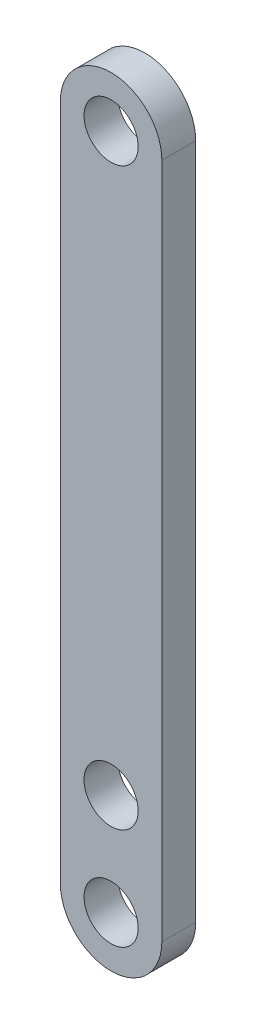
ISO-10303-21;
HEADER;
FILE_DESCRIPTION(('STEP AP214'),'2;1');
FILE_NAME('part.step','',(''),(''),'','','');
FILE_SCHEMA(('AUTOMOTIVE_DESIGN { 1 0 10303 214 1 1 1 1 }'));
ENDSEC;
DATA;
#1=APPLICATION_CONTEXT('core data for automotive mechanical design processes');
#2=APPLICATION_PROTOCOL_DEFINITION('international standard','automotive_design',2000,#1);
#3=PRODUCT_CONTEXT('',#1,'mechanical');
#4=PRODUCT('Part','Part','',(#3));
#5=PRODUCT_RELATED_PRODUCT_CATEGORY('part','',(#4));
#6=PRODUCT_DEFINITION_FORMATION('','',#4);
#7=PRODUCT_DEFINITION_CONTEXT('part definition',#1,'design');
#8=PRODUCT_DEFINITION('design','',#6,#7);
#9=PRODUCT_DEFINITION_SHAPE('','',#8);
#10=(LENGTH_UNIT() NAMED_UNIT(*) SI_UNIT(.MILLI.,.METRE.));
#11=(NAMED_UNIT(*) PLANE_ANGLE_UNIT() SI_UNIT($,.RADIAN.));
#12=(NAMED_UNIT(*) SI_UNIT($,.STERADIAN.) SOLID_ANGLE_UNIT());
#13=UNCERTAINTY_MEASURE_WITH_UNIT(LENGTH_MEASURE(1.E-05),#10,'distance_accuracy_value','');
#14=(GEOMETRIC_REPRESENTATION_CONTEXT(3) GLOBAL_UNCERTAINTY_ASSIGNED_CONTEXT((#13)) GLOBAL_UNIT_ASSIGNED_CONTEXT((#10,
#11,#12)) REPRESENTATION_CONTEXT('',''));
#15=CARTESIAN_POINT('',(0.,0.,0.));
#16=DIRECTION('',(0.,0.,1.));
#17=DIRECTION('',(1.,0.,0.));
#18=AXIS2_PLACEMENT_3D('',#15,#16,#17);
#19=CARTESIAN_POINT('',(0.,50.,5.));
#20=DIRECTION('',(0.,0.,-1.));
#21=DIRECTION('',(-1.,0.,0.));
#22=AXIS2_PLACEMENT_3D('',#19,#20,#21);
#23=PLANE('',#22);
#24=CARTESIAN_POINT('',(0.,-35.,5.));
#25=DIRECTION('',(0.,0.,1.));
#26=DIRECTION('',(1.,0.,0.));
#27=AXIS2_PLACEMENT_3D('',#24,#25,#26);
#28=CIRCLE('',#27,4.);
#29=CARTESIAN_POINT('',(4.00000000000001,-35.,5.));
#30=VERTEX_POINT('',#29);
#31=EDGE_CURVE('E112',#30,#30,#28,.T.);
#32=ORIENTED_EDGE('',*,*,#31,.F.);
#33=EDGE_LOOP('',(#32));
#34=FACE_BOUND('',#33,.T.);
#35=CARTESIAN_POINT('',(0.,50.,5.));
#36=DIRECTION('',(0.,0.,1.));
#37=DIRECTION('',(-1.,0.,0.));
#38=AXIS2_PLACEMENT_3D('',#35,#36,#37);
#39=CIRCLE('',#38,7.5);
#40=CARTESIAN_POINT('',(7.5,50.,5.));
#41=VERTEX_POINT('',#40);
#42=CARTESIAN_POINT('',(-7.5,50.,5.));
#43=VERTEX_POINT('',#42);
#44=EDGE_CURVE('E82',#41,#43,#39,.T.);
#45=ORIENTED_EDGE('',*,*,#44,.T.);
#46=DIRECTION('',(0.,-1.,0.));
#47=VECTOR('',#46,1.);
#48=CARTESIAN_POINT('',(-7.5,-50.,5.));
#49=LINE('',#48,#47);
#50=CARTESIAN_POINT('',(-7.5,-50.,5.));
#51=VERTEX_POINT('',#50);
#52=EDGE_CURVE('E77',#43,#51,#49,.T.);
#53=ORIENTED_EDGE('',*,*,#52,.T.);
#54=CARTESIAN_POINT('',(0.,-50.,5.));
#55=DIRECTION('',(0.,0.,1.));
#56=DIRECTION('',(1.,0.,0.));
#57=AXIS2_PLACEMENT_3D('',#54,#55,#56);
#58=CIRCLE('',#57,7.5);
#59=CARTESIAN_POINT('',(7.5,-50.,5.));
#60=VERTEX_POINT('',#59);
#61=EDGE_CURVE('E80',#51,#60,#58,.T.);
#62=ORIENTED_EDGE('',*,*,#61,.T.);
#63=DIRECTION('',(0.,1.,0.));
#64=VECTOR('',#63,1.);
#65=CARTESIAN_POINT('',(7.5,-50.,5.));
#66=LINE('',#65,#64);
#67=EDGE_CURVE('E47',#60,#41,#66,.T.);
#68=ORIENTED_EDGE('',*,*,#67,.T.);
#69=EDGE_LOOP('',(#45,#53,#62,#68));
#70=FACE_BOUND('',#69,.T.);
#71=CARTESIAN_POINT('',(0.,50.,5.));
#72=DIRECTION('',(0.,0.,1.));
#73=DIRECTION('',(1.,0.,0.));
#74=AXIS2_PLACEMENT_3D('',#71,#72,#73);
#75=CIRCLE('',#74,3.99999999999999);
#76=CARTESIAN_POINT('',(4.,50.,5.));
#77=VERTEX_POINT('',#76);
#78=EDGE_CURVE('E97',#77,#77,#75,.T.);
#79=ORIENTED_EDGE('',*,*,#78,.F.);
#80=EDGE_LOOP('',(#79));
#81=FACE_BOUND('',#80,.T.);
#82=CARTESIAN_POINT('',(0.,-50.,5.));
#83=DIRECTION('',(0.,0.,1.));
#84=DIRECTION('',(1.,0.,0.));
#85=AXIS2_PLACEMENT_3D('',#82,#83,#84);
#86=CIRCLE('',#85,4.00000000000001);
#87=CARTESIAN_POINT('',(4.00000000000001,-50.,5.));
#88=VERTEX_POINT('',#87);
#89=EDGE_CURVE('E118',#88,#88,#86,.T.);
#90=ORIENTED_EDGE('',*,*,#89,.F.);
#91=EDGE_LOOP('',(#90));
#92=FACE_BOUND('',#91,.T.);
#93=ADVANCED_FACE('F30',(#34,#70,#81,#92),#23,.F.);
#94=CARTESIAN_POINT('',(0.,50.,0.));
#95=DIRECTION('',(0.,0.,-1.));
#96=DIRECTION('',(-1.,0.,0.));
#97=AXIS2_PLACEMENT_3D('',#94,#95,#96);
#98=PLANE('',#97);
#99=CARTESIAN_POINT('',(0.,-35.,0.));
#100=DIRECTION('',(0.,0.,1.));
#101=DIRECTION('',(1.,0.,0.));
#102=AXIS2_PLACEMENT_3D('',#99,#100,#101);
#103=CIRCLE('',#102,4.);
#104=CARTESIAN_POINT('',(4.00000000000001,-35.,0.));
#105=VERTEX_POINT('',#104);
#106=EDGE_CURVE('E115',#105,#105,#103,.T.);
#107=ORIENTED_EDGE('',*,*,#106,.T.);
#108=EDGE_LOOP('',(#107));
#109=FACE_BOUND('',#108,.T.);
#110=CARTESIAN_POINT('',(0.,50.,0.));
#111=DIRECTION('',(0.,0.,1.));
#112=DIRECTION('',(-1.,0.,0.));
#113=AXIS2_PLACEMENT_3D('',#110,#111,#112);
#114=CIRCLE('',#113,7.5);
#115=CARTESIAN_POINT('',(7.5,50.,0.));
#116=VERTEX_POINT('',#115);
#117=CARTESIAN_POINT('',(-7.5,50.,0.));
#118=VERTEX_POINT('',#117);
#119=EDGE_CURVE('E94',#116,#118,#114,.T.);
#120=ORIENTED_EDGE('',*,*,#119,.F.);
#121=DIRECTION('',(0.,1.,0.));
#122=VECTOR('',#121,1.);
#123=CARTESIAN_POINT('',(7.5,-50.,0.));
#124=LINE('',#123,#122);
#125=CARTESIAN_POINT('',(7.5,-50.,0.));
#126=VERTEX_POINT('',#125);
#127=EDGE_CURVE('E70',#126,#116,#124,.T.);
#128=ORIENTED_EDGE('',*,*,#127,.F.);
#129=CARTESIAN_POINT('',(0.,-50.,0.));
#130=DIRECTION('',(0.,0.,1.));
#131=DIRECTION('',(1.,0.,0.));
#132=AXIS2_PLACEMENT_3D('',#129,#130,#131);
#133=CIRCLE('',#132,7.5);
#134=CARTESIAN_POINT('',(-7.5,-50.,0.));
#135=VERTEX_POINT('',#134);
#136=EDGE_CURVE('E64',#135,#126,#133,.T.);
#137=ORIENTED_EDGE('',*,*,#136,.F.);
#138=DIRECTION('',(0.,-1.,0.));
#139=VECTOR('',#138,1.);
#140=CARTESIAN_POINT('',(-7.5,-50.,0.));
#141=LINE('',#140,#139);
#142=EDGE_CURVE('E86',#118,#135,#141,.T.);
#143=ORIENTED_EDGE('',*,*,#142,.F.);
#144=EDGE_LOOP('',(#120,#128,#137,#143));
#145=FACE_BOUND('',#144,.T.);
#146=CARTESIAN_POINT('',(0.,50.,0.));
#147=DIRECTION('',(0.,0.,1.));
#148=DIRECTION('',(1.,0.,0.));
#149=AXIS2_PLACEMENT_3D('',#146,#147,#148);
#150=CIRCLE('',#149,3.99999999999999);
#151=CARTESIAN_POINT('',(4.,50.,0.));
#152=VERTEX_POINT('',#151);
#153=EDGE_CURVE('E109',#152,#152,#150,.T.);
#154=ORIENTED_EDGE('',*,*,#153,.T.);
#155=EDGE_LOOP('',(#154));
#156=FACE_BOUND('',#155,.T.);
#157=CARTESIAN_POINT('',(0.,-50.,0.));
#158=DIRECTION('',(0.,0.,1.));
#159=DIRECTION('',(1.,0.,0.));
#160=AXIS2_PLACEMENT_3D('',#157,#158,#159);
#161=CIRCLE('',#160,4.00000000000001);
#162=CARTESIAN_POINT('',(4.00000000000001,-50.,0.));
#163=VERTEX_POINT('',#162);
#164=EDGE_CURVE('E121',#163,#163,#161,.T.);
#165=ORIENTED_EDGE('',*,*,#164,.T.);
#166=EDGE_LOOP('',(#165));
#167=FACE_BOUND('',#166,.T.);
#168=ADVANCED_FACE('F105',(#109,#145,#156,#167),#98,.T.);
#169=CARTESIAN_POINT('',(0.,50.,5.));
#170=DIRECTION('',(0.,0.,-1.));
#171=DIRECTION('',(-1.,0.,0.));
#172=AXIS2_PLACEMENT_3D('',#169,#170,#171);
#173=CYLINDRICAL_SURFACE('',#172,7.5);
#174=ORIENTED_EDGE('',*,*,#119,.T.);
#175=DIRECTION('',(0.,0.,-1.));
#176=VECTOR('',#175,1.);
#177=CARTESIAN_POINT('',(-7.5,50.,5.));
#178=LINE('',#177,#176);
#179=EDGE_CURVE('E11',#43,#118,#178,.T.);
#180=ORIENTED_EDGE('',*,*,#179,.F.);
#181=ORIENTED_EDGE('',*,*,#44,.F.);
#182=DIRECTION('',(0.,0.,-1.));
#183=VECTOR('',#182,1.);
#184=CARTESIAN_POINT('',(7.5,50.,5.));
#185=LINE('',#184,#183);
#186=EDGE_CURVE('E90',#41,#116,#185,.T.);
#187=ORIENTED_EDGE('',*,*,#186,.T.);
#188=EDGE_LOOP('',(#174,#180,#181,#187));
#189=FACE_BOUND('',#188,.T.);
#190=ADVANCED_FACE('F32',(#189),#173,.T.);
#191=CARTESIAN_POINT('',(-7.5,-50.,5.));
#192=DIRECTION('',(1.,0.,0.));
#193=DIRECTION('',(0.,0.,-1.));
#194=AXIS2_PLACEMENT_3D('',#191,#192,#193);
#195=PLANE('',#194);
#196=ORIENTED_EDGE('',*,*,#142,.T.);
#197=DIRECTION('',(0.,0.,-1.));
#198=VECTOR('',#197,1.);
#199=CARTESIAN_POINT('',(-7.5,-50.,5.));
#200=LINE('',#199,#198);
#201=EDGE_CURVE('E39',#51,#135,#200,.T.);
#202=ORIENTED_EDGE('',*,*,#201,.F.);
#203=ORIENTED_EDGE('',*,*,#52,.F.);
#204=ORIENTED_EDGE('',*,*,#179,.T.);
#205=EDGE_LOOP('',(#196,#202,#203,#204));
#206=FACE_BOUND('',#205,.T.);
#207=ADVANCED_FACE('F85',(#206),#195,.F.);
#208=CARTESIAN_POINT('',(0.,-50.,5.));
#209=DIRECTION('',(0.,0.,-1.));
#210=DIRECTION('',(-1.,0.,0.));
#211=AXIS2_PLACEMENT_3D('',#208,#209,#210);
#212=CYLINDRICAL_SURFACE('',#211,7.5);
#213=ORIENTED_EDGE('',*,*,#136,.T.);
#214=DIRECTION('',(0.,0.,-1.));
#215=VECTOR('',#214,1.);
#216=CARTESIAN_POINT('',(7.5,-50.,5.));
#217=LINE('',#216,#215);
#218=EDGE_CURVE('E87',#60,#126,#217,.T.);
#219=ORIENTED_EDGE('',*,*,#218,.F.);
#220=ORIENTED_EDGE('',*,*,#61,.F.);
#221=ORIENTED_EDGE('',*,*,#201,.T.);
#222=EDGE_LOOP('',(#213,#219,#220,#221));
#223=FACE_BOUND('',#222,.T.);
#224=ADVANCED_FACE('F88',(#223),#212,.T.);
#225=CARTESIAN_POINT('',(7.5,-50.,5.));
#226=DIRECTION('',(-1.,0.,0.));
#227=DIRECTION('',(0.,0.,1.));
#228=AXIS2_PLACEMENT_3D('',#225,#226,#227);
#229=PLANE('',#228);
#230=ORIENTED_EDGE('',*,*,#127,.T.);
#231=ORIENTED_EDGE('',*,*,#186,.F.);
#232=ORIENTED_EDGE('',*,*,#67,.F.);
#233=ORIENTED_EDGE('',*,*,#218,.T.);
#234=EDGE_LOOP('',(#230,#231,#232,#233));
#235=FACE_BOUND('',#234,.T.);
#236=ADVANCED_FACE('F102',(#235),#229,.F.);
#237=CARTESIAN_POINT('',(0.,50.,5.));
#238=DIRECTION('',(0.,0.,-1.));
#239=DIRECTION('',(-1.,0.,0.));
#240=AXIS2_PLACEMENT_3D('',#237,#238,#239);
#241=CYLINDRICAL_SURFACE('',#240,3.99999999999999);
#242=ORIENTED_EDGE('',*,*,#78,.T.);
#243=EDGE_LOOP('',(#242));
#244=FACE_BOUND('',#243,.T.);
#245=ORIENTED_EDGE('',*,*,#153,.F.);
#246=EDGE_LOOP('',(#245));
#247=FACE_BOUND('',#246,.T.);
#248=ADVANCED_FACE('F140',(#244,#247),#241,.F.);
#249=CARTESIAN_POINT('',(0.,-35.,5.));
#250=DIRECTION('',(0.,0.,-1.));
#251=DIRECTION('',(-1.,0.,0.));
#252=AXIS2_PLACEMENT_3D('',#249,#250,#251);
#253=CYLINDRICAL_SURFACE('',#252,4.);
#254=ORIENTED_EDGE('',*,*,#31,.T.);
#255=EDGE_LOOP('',(#254));
#256=FACE_BOUND('',#255,.T.);
#257=ORIENTED_EDGE('',*,*,#106,.F.);
#258=EDGE_LOOP('',(#257));
#259=FACE_BOUND('',#258,.T.);
#260=ADVANCED_FACE('F186',(#256,#259),#253,.F.);
#261=CARTESIAN_POINT('',(0.,-50.,5.));
#262=DIRECTION('',(0.,0.,-1.));
#263=DIRECTION('',(-1.,0.,0.));
#264=AXIS2_PLACEMENT_3D('',#261,#262,#263);
#265=CYLINDRICAL_SURFACE('',#264,4.00000000000001);
#266=ORIENTED_EDGE('',*,*,#89,.T.);
#267=EDGE_LOOP('',(#266));
#268=FACE_BOUND('',#267,.T.);
#269=ORIENTED_EDGE('',*,*,#164,.F.);
#270=EDGE_LOOP('',(#269));
#271=FACE_BOUND('',#270,.T.);
#272=ADVANCED_FACE('F127',(#268,#271),#265,.F.);
#273=CLOSED_SHELL('',(#93,#168,#190,#207,#224,#236,#248,#260,#272));
#274=MANIFOLD_SOLID_BREP('B2',#273);
#275=ADVANCED_BREP_SHAPE_REPRESENTATION('',(#18,#274),#14);
#276=SHAPE_DEFINITION_REPRESENTATION(#9,#275);
ENDSEC;
END-ISO-10303-21;
